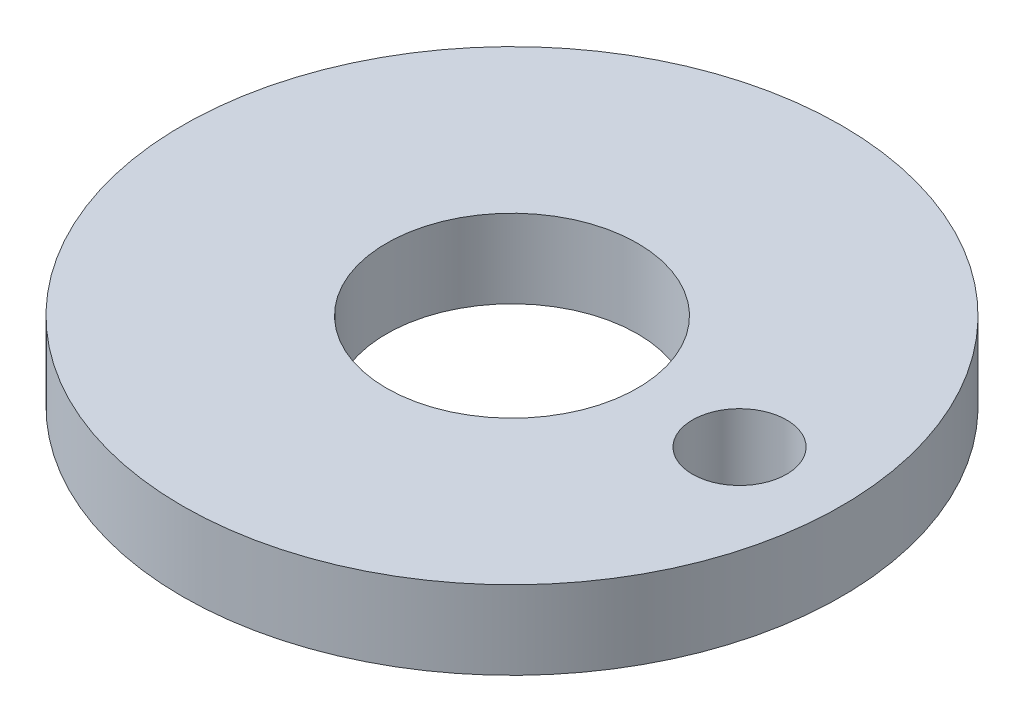
ISO-10303-21;
HEADER;
FILE_DESCRIPTION(('STEP AP214'),'2;1');
FILE_NAME('part.step','',(''),(''),'','','');
FILE_SCHEMA(('AUTOMOTIVE_DESIGN { 1 0 10303 214 1 1 1 1 }'));
ENDSEC;
DATA;
#1=APPLICATION_CONTEXT('core data for automotive mechanical design processes');
#2=APPLICATION_PROTOCOL_DEFINITION('international standard','automotive_design',2000,#1);
#3=PRODUCT_CONTEXT('',#1,'mechanical');
#4=PRODUCT('Part','Part','',(#3));
#5=PRODUCT_RELATED_PRODUCT_CATEGORY('part','',(#4));
#6=PRODUCT_DEFINITION_FORMATION('','',#4);
#7=PRODUCT_DEFINITION_CONTEXT('part definition',#1,'design');
#8=PRODUCT_DEFINITION('design','',#6,#7);
#9=PRODUCT_DEFINITION_SHAPE('','',#8);
#10=(LENGTH_UNIT() NAMED_UNIT(*) SI_UNIT(.MILLI.,.METRE.));
#11=(NAMED_UNIT(*) PLANE_ANGLE_UNIT() SI_UNIT($,.RADIAN.));
#12=(NAMED_UNIT(*) SI_UNIT($,.STERADIAN.) SOLID_ANGLE_UNIT());
#13=UNCERTAINTY_MEASURE_WITH_UNIT(LENGTH_MEASURE(1.E-05),#10,'distance_accuracy_value','');
#14=(GEOMETRIC_REPRESENTATION_CONTEXT(3) GLOBAL_UNCERTAINTY_ASSIGNED_CONTEXT((#13)) GLOBAL_UNIT_ASSIGNED_CONTEXT((#10,
#11,#12)) REPRESENTATION_CONTEXT('',''));
#15=CARTESIAN_POINT('',(0.,0.,0.));
#16=DIRECTION('',(0.,0.,1.));
#17=DIRECTION('',(1.,0.,0.));
#18=AXIS2_PLACEMENT_3D('',#15,#16,#17);
#19=CARTESIAN_POINT('',(0.,2.5,0.));
#20=DIRECTION('',(0.,-1.,0.));
#21=DIRECTION('',(0.,0.,-1.));
#22=AXIS2_PLACEMENT_3D('',#19,#20,#21);
#23=CYLINDRICAL_SURFACE('',#22,10.5);
#24=CARTESIAN_POINT('',(0.,2.5,0.));
#25=DIRECTION('',(0.,1.,0.));
#26=DIRECTION('',(0.,0.,1.));
#27=AXIS2_PLACEMENT_3D('',#24,#25,#26);
#28=CIRCLE('',#27,10.5);
#29=CARTESIAN_POINT('',(0.,2.5,10.5));
#30=VERTEX_POINT('',#29);
#31=EDGE_CURVE('E10',#30,#30,#28,.T.);
#32=ORIENTED_EDGE('',*,*,#31,.F.);
#33=EDGE_LOOP('',(#32));
#34=FACE_BOUND('',#33,.T.);
#35=CARTESIAN_POINT('',(0.,0.,0.));
#36=DIRECTION('',(0.,1.,0.));
#37=DIRECTION('',(0.,0.,1.));
#38=AXIS2_PLACEMENT_3D('',#35,#36,#37);
#39=CIRCLE('',#38,10.5);
#40=CARTESIAN_POINT('',(0.,0.,10.5));
#41=VERTEX_POINT('',#40);
#42=EDGE_CURVE('E44',#41,#41,#39,.T.);
#43=ORIENTED_EDGE('',*,*,#42,.T.);
#44=EDGE_LOOP('',(#43));
#45=FACE_BOUND('',#44,.T.);
#46=ADVANCED_FACE('F37',(#34,#45),#23,.T.);
#47=CARTESIAN_POINT('',(0.,2.5,0.));
#48=DIRECTION('',(0.,1.,0.));
#49=DIRECTION('',(0.,0.,1.));
#50=AXIS2_PLACEMENT_3D('',#47,#48,#49);
#51=PLANE('',#50);
#52=CARTESIAN_POINT('',(0.,2.5,0.));
#53=DIRECTION('',(0.,1.,0.));
#54=DIRECTION('',(0.,0.,1.));
#55=AXIS2_PLACEMENT_3D('',#52,#53,#54);
#56=CIRCLE('',#55,4.);
#57=CARTESIAN_POINT('',(0.,2.5,4.));
#58=VERTEX_POINT('',#57);
#59=EDGE_CURVE('E55',#58,#58,#56,.T.);
#60=ORIENTED_EDGE('',*,*,#59,.F.);
#61=EDGE_LOOP('',(#60));
#62=FACE_BOUND('',#61,.T.);
#63=CARTESIAN_POINT('',(7.25,2.5,0.));
#64=DIRECTION('',(0.,1.,0.));
#65=DIRECTION('',(0.,0.,1.));
#66=AXIS2_PLACEMENT_3D('',#63,#64,#65);
#67=CIRCLE('',#66,1.5);
#68=CARTESIAN_POINT('',(7.25,2.5,1.5));
#69=VERTEX_POINT('',#68);
#70=EDGE_CURVE('E51',#69,#69,#67,.T.);
#71=ORIENTED_EDGE('',*,*,#70,.F.);
#72=EDGE_LOOP('',(#71));
#73=FACE_BOUND('',#72,.T.);
#74=ORIENTED_EDGE('',*,*,#31,.T.);
#75=EDGE_LOOP('',(#74));
#76=FACE_BOUND('',#75,.T.);
#77=ADVANCED_FACE('F68',(#62,#73,#76),#51,.T.);
#78=CARTESIAN_POINT('',(0.,0.,0.));
#79=DIRECTION('',(0.,1.,0.));
#80=DIRECTION('',(0.,0.,1.));
#81=AXIS2_PLACEMENT_3D('',#78,#79,#80);
#82=PLANE('',#81);
#83=CARTESIAN_POINT('',(0.,0.,0.));
#84=DIRECTION('',(0.,1.,0.));
#85=DIRECTION('',(0.,0.,1.));
#86=AXIS2_PLACEMENT_3D('',#83,#84,#85);
#87=CIRCLE('',#86,4.);
#88=CARTESIAN_POINT('',(0.,0.,4.));
#89=VERTEX_POINT('',#88);
#90=EDGE_CURVE('E40',#89,#89,#87,.T.);
#91=ORIENTED_EDGE('',*,*,#90,.T.);
#92=EDGE_LOOP('',(#91));
#93=FACE_BOUND('',#92,.T.);
#94=CARTESIAN_POINT('',(7.25,0.,0.));
#95=DIRECTION('',(0.,1.,0.));
#96=DIRECTION('',(0.,0.,1.));
#97=AXIS2_PLACEMENT_3D('',#94,#95,#96);
#98=CIRCLE('',#97,1.5);
#99=CARTESIAN_POINT('',(7.25,0.,1.5));
#100=VERTEX_POINT('',#99);
#101=EDGE_CURVE('E53',#100,#100,#98,.T.);
#102=ORIENTED_EDGE('',*,*,#101,.T.);
#103=EDGE_LOOP('',(#102));
#104=FACE_BOUND('',#103,.T.);
#105=ORIENTED_EDGE('',*,*,#42,.F.);
#106=EDGE_LOOP('',(#105));
#107=FACE_BOUND('',#106,.T.);
#108=ADVANCED_FACE('F70',(#93,#104,#107),#82,.F.);
#109=CARTESIAN_POINT('',(7.25,-7.5,0.));
#110=DIRECTION('',(0.,1.,0.));
#111=DIRECTION('',(0.,0.,1.));
#112=AXIS2_PLACEMENT_3D('',#109,#110,#111);
#113=CYLINDRICAL_SURFACE('',#112,1.5);
#114=ORIENTED_EDGE('',*,*,#70,.T.);
#115=EDGE_LOOP('',(#114));
#116=FACE_BOUND('',#115,.T.);
#117=ORIENTED_EDGE('',*,*,#101,.F.);
#118=EDGE_LOOP('',(#117));
#119=FACE_BOUND('',#118,.T.);
#120=ADVANCED_FACE('F65',(#116,#119),#113,.F.);
#121=CARTESIAN_POINT('',(0.,-7.5,0.));
#122=DIRECTION('',(0.,1.,0.));
#123=DIRECTION('',(0.,0.,1.));
#124=AXIS2_PLACEMENT_3D('',#121,#122,#123);
#125=CYLINDRICAL_SURFACE('',#124,4.);
#126=ORIENTED_EDGE('',*,*,#59,.T.);
#127=EDGE_LOOP('',(#126));
#128=FACE_BOUND('',#127,.T.);
#129=ORIENTED_EDGE('',*,*,#90,.F.);
#130=EDGE_LOOP('',(#129));
#131=FACE_BOUND('',#130,.T.);
#132=ADVANCED_FACE('F82',(#128,#131),#125,.F.);
#133=CLOSED_SHELL('',(#46,#77,#108,#120,#132));
#134=MANIFOLD_SOLID_BREP('B2',#133);
#135=ADVANCED_BREP_SHAPE_REPRESENTATION('',(#18,#134),#14);
#136=SHAPE_DEFINITION_REPRESENTATION(#9,#135);
ENDSEC;
END-ISO-10303-21;
